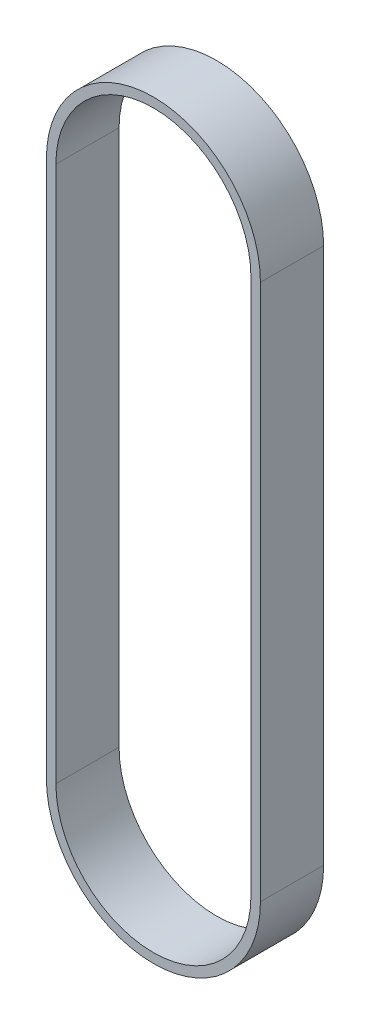
ISO-10303-21;
HEADER;
FILE_DESCRIPTION(('STEP AP214'),'2;1');
FILE_NAME('part.step','',(''),(''),'','','');
FILE_SCHEMA(('AUTOMOTIVE_DESIGN { 1 0 10303 214 1 1 1 1 }'));
ENDSEC;
DATA;
#1=APPLICATION_CONTEXT('core data for automotive mechanical design processes');
#2=APPLICATION_PROTOCOL_DEFINITION('international standard','automotive_design',2000,#1);
#3=PRODUCT_CONTEXT('',#1,'mechanical');
#4=PRODUCT('Part','Part','',(#3));
#5=PRODUCT_RELATED_PRODUCT_CATEGORY('part','',(#4));
#6=PRODUCT_DEFINITION_FORMATION('','',#4);
#7=PRODUCT_DEFINITION_CONTEXT('part definition',#1,'design');
#8=PRODUCT_DEFINITION('design','',#6,#7);
#9=PRODUCT_DEFINITION_SHAPE('','',#8);
#10=(LENGTH_UNIT() NAMED_UNIT(*) SI_UNIT(.MILLI.,.METRE.));
#11=(NAMED_UNIT(*) PLANE_ANGLE_UNIT() SI_UNIT($,.RADIAN.));
#12=(NAMED_UNIT(*) SI_UNIT($,.STERADIAN.) SOLID_ANGLE_UNIT());
#13=UNCERTAINTY_MEASURE_WITH_UNIT(LENGTH_MEASURE(1.E-05),#10,'distance_accuracy_value','');
#14=(GEOMETRIC_REPRESENTATION_CONTEXT(3) GLOBAL_UNCERTAINTY_ASSIGNED_CONTEXT((#13)) GLOBAL_UNIT_ASSIGNED_CONTEXT((#10,
#11,#12)) REPRESENTATION_CONTEXT('',''));
#15=CARTESIAN_POINT('',(0.,0.,0.));
#16=DIRECTION('',(0.,0.,1.));
#17=DIRECTION('',(1.,0.,0.));
#18=AXIS2_PLACEMENT_3D('',#15,#16,#17);
#19=CARTESIAN_POINT('',(2.77555756156289E-13,1.40512601554121E-13,5.));
#20=DIRECTION('',(0.,0.,-1.));
#21=DIRECTION('',(-1.,0.,0.));
#22=AXIS2_PLACEMENT_3D('',#19,#20,#21);
#23=PLANE('',#22);
#24=CARTESIAN_POINT('',(2.77555756156289E-13,1.40512601554121E-13,5.));
#25=DIRECTION('',(0.,0.,-1.));
#26=DIRECTION('',(-1.,0.,0.));
#27=AXIS2_PLACEMENT_3D('',#24,#25,#26);
#28=CIRCLE('',#27,16.935);
#29=CARTESIAN_POINT('',(16.9350000000003,0.,5.));
#30=VERTEX_POINT('',#29);
#31=CARTESIAN_POINT('',(-16.9349999999997,3.88578058618805E-13,5.));
#32=VERTEX_POINT('',#31);
#33=EDGE_CURVE('E164',#30,#32,#28,.F.);
#34=ORIENTED_EDGE('',*,*,#33,.T.);
#35=DIRECTION('',(0.,-1.,0.));
#36=VECTOR('',#35,1.);
#37=CARTESIAN_POINT('',(-16.9349999999997,3.78577960107466E-13,5.));
#38=LINE('',#37,#36);
#39=CARTESIAN_POINT('',(-16.9350000000009,-84.8999999999999,5.));
#40=VERTEX_POINT('',#39);
#41=EDGE_CURVE('E167',#32,#40,#38,.T.);
#42=ORIENTED_EDGE('',*,*,#41,.T.);
#43=CARTESIAN_POINT('',(-9.15933995315754E-13,-84.9000000000001,5.));
#44=DIRECTION('',(0.,0.,-1.));
#45=DIRECTION('',(-1.,0.,0.));
#46=AXIS2_PLACEMENT_3D('',#43,#44,#45);
#47=CIRCLE('',#46,16.935);
#48=CARTESIAN_POINT('',(16.9349999999991,-84.9000000000003,5.));
#49=VERTEX_POINT('',#48);
#50=EDGE_CURVE('E170',#40,#49,#47,.F.);
#51=ORIENTED_EDGE('',*,*,#50,.T.);
#52=DIRECTION('',(0.,1.,0.));
#53=VECTOR('',#52,1.);
#54=CARTESIAN_POINT('',(16.9350000000003,0.,5.));
#55=LINE('',#54,#53);
#56=EDGE_CURVE('E172',#49,#30,#55,.T.);
#57=ORIENTED_EDGE('',*,*,#56,.T.);
#58=EDGE_LOOP('',(#34,#42,#51,#57));
#59=FACE_BOUND('',#58,.T.);
#60=CARTESIAN_POINT('',(2.77555756156289E-13,1.40512601554121E-13,5.));
#61=DIRECTION('',(0.,0.,1.));
#62=DIRECTION('',(-1.,0.,0.));
#63=AXIS2_PLACEMENT_3D('',#60,#61,#62);
#64=CIRCLE('',#63,15.435);
#65=CARTESIAN_POINT('',(15.4350000000003,0.,5.));
#66=VERTEX_POINT('',#65);
#67=CARTESIAN_POINT('',(-15.4349999999997,3.57491568738702E-13,5.));
#68=VERTEX_POINT('',#67);
#69=EDGE_CURVE('E128',#66,#68,#64,.T.);
#70=ORIENTED_EDGE('',*,*,#69,.F.);
#71=DIRECTION('',(0.,1.,0.));
#72=VECTOR('',#71,1.);
#73=CARTESIAN_POINT('',(15.4350000000003,0.,5.));
#74=LINE('',#73,#72);
#75=CARTESIAN_POINT('',(15.4349999999991,-84.9000000000003,5.));
#76=VERTEX_POINT('',#75);
#77=EDGE_CURVE('E150',#76,#66,#74,.T.);
#78=ORIENTED_EDGE('',*,*,#77,.F.);
#79=CARTESIAN_POINT('',(-9.15933995315754E-13,-84.9000000000001,5.));
#80=DIRECTION('',(0.,0.,1.));
#81=DIRECTION('',(-1.,0.,0.));
#82=AXIS2_PLACEMENT_3D('',#79,#80,#81);
#83=CIRCLE('',#82,15.435);
#84=CARTESIAN_POINT('',(-15.4350000000009,-84.8999999999999,5.));
#85=VERTEX_POINT('',#84);
#86=EDGE_CURVE('E148',#85,#76,#83,.T.);
#87=ORIENTED_EDGE('',*,*,#86,.F.);
#88=DIRECTION('',(0.,-1.,0.));
#89=VECTOR('',#88,1.);
#90=CARTESIAN_POINT('',(-15.4350000000009,-84.8999999999999,5.));
#91=LINE('',#90,#89);
#92=EDGE_CURVE('E136',#68,#85,#91,.T.);
#93=ORIENTED_EDGE('',*,*,#92,.F.);
#94=EDGE_LOOP('',(#70,#78,#87,#93));
#95=FACE_BOUND('',#94,.T.);
#96=ADVANCED_FACE('F63',(#59,#95),#23,.F.);
#97=CARTESIAN_POINT('',(2.77555756156289E-13,1.40512601554121E-13,-5.));
#98=DIRECTION('',(0.,0.,-1.));
#99=DIRECTION('',(-1.,0.,0.));
#100=AXIS2_PLACEMENT_3D('',#97,#98,#99);
#101=PLANE('',#100);
#102=CARTESIAN_POINT('',(2.77555756156289E-13,1.40512601554121E-13,-5.));
#103=DIRECTION('',(0.,0.,-1.));
#104=DIRECTION('',(-1.,0.,0.));
#105=AXIS2_PLACEMENT_3D('',#102,#103,#104);
#106=CIRCLE('',#105,16.935);
#107=CARTESIAN_POINT('',(16.9350000000003,0.,-5.));
#108=VERTEX_POINT('',#107);
#109=CARTESIAN_POINT('',(-16.9349999999997,3.88578058618805E-13,-5.));
#110=VERTEX_POINT('',#109);
#111=EDGE_CURVE('E144',#108,#110,#106,.F.);
#112=ORIENTED_EDGE('',*,*,#111,.F.);
#113=DIRECTION('',(0.,1.,0.));
#114=VECTOR('',#113,1.);
#115=CARTESIAN_POINT('',(16.9350000000003,0.,-5.));
#116=LINE('',#115,#114);
#117=CARTESIAN_POINT('',(16.9349999999991,-84.9000000000003,-5.));
#118=VERTEX_POINT('',#117);
#119=EDGE_CURVE('E168',#118,#108,#116,.T.);
#120=ORIENTED_EDGE('',*,*,#119,.F.);
#121=CARTESIAN_POINT('',(-9.15933995315754E-13,-84.9000000000001,-5.));
#122=DIRECTION('',(0.,0.,-1.));
#123=DIRECTION('',(-1.,0.,0.));
#124=AXIS2_PLACEMENT_3D('',#121,#122,#123);
#125=CIRCLE('',#124,16.935);
#126=CARTESIAN_POINT('',(-16.9350000000009,-84.8999999999999,-5.));
#127=VERTEX_POINT('',#126);
#128=EDGE_CURVE('E179',#127,#118,#125,.F.);
#129=ORIENTED_EDGE('',*,*,#128,.F.);
#130=DIRECTION('',(0.,-1.,0.));
#131=VECTOR('',#130,1.);
#132=CARTESIAN_POINT('',(-16.9349999999997,3.78577960107466E-13,-5.));
#133=LINE('',#132,#131);
#134=EDGE_CURVE('E177',#110,#127,#133,.T.);
#135=ORIENTED_EDGE('',*,*,#134,.F.);
#136=EDGE_LOOP('',(#112,#120,#129,#135));
#137=FACE_BOUND('',#136,.T.);
#138=DIRECTION('',(0.,1.,0.));
#139=VECTOR('',#138,1.);
#140=CARTESIAN_POINT('',(15.4350000000003,0.,-5.));
#141=LINE('',#140,#139);
#142=CARTESIAN_POINT('',(15.4349999999991,-84.9000000000003,-5.));
#143=VERTEX_POINT('',#142);
#144=CARTESIAN_POINT('',(15.4350000000003,0.,-5.));
#145=VERTEX_POINT('',#144);
#146=EDGE_CURVE('E137',#143,#145,#141,.T.);
#147=ORIENTED_EDGE('',*,*,#146,.T.);
#148=CARTESIAN_POINT('',(2.77555756156289E-13,1.40512601554121E-13,-5.));
#149=DIRECTION('',(0.,0.,1.));
#150=DIRECTION('',(-1.,0.,0.));
#151=AXIS2_PLACEMENT_3D('',#148,#149,#150);
#152=CIRCLE('',#151,15.435);
#153=CARTESIAN_POINT('',(-15.4349999999997,3.57491568738702E-13,-5.));
#154=VERTEX_POINT('',#153);
#155=EDGE_CURVE('E86',#145,#154,#152,.T.);
#156=ORIENTED_EDGE('',*,*,#155,.T.);
#157=DIRECTION('',(0.,-1.,0.));
#158=VECTOR('',#157,1.);
#159=CARTESIAN_POINT('',(-15.4350000000009,-84.8999999999999,-5.));
#160=LINE('',#159,#158);
#161=CARTESIAN_POINT('',(-15.4350000000009,-84.8999999999999,-5.));
#162=VERTEX_POINT('',#161);
#163=EDGE_CURVE('E143',#154,#162,#160,.T.);
#164=ORIENTED_EDGE('',*,*,#163,.T.);
#165=CARTESIAN_POINT('',(-9.15933995315754E-13,-84.9000000000001,-5.));
#166=DIRECTION('',(0.,0.,1.));
#167=DIRECTION('',(-1.,0.,0.));
#168=AXIS2_PLACEMENT_3D('',#165,#166,#167);
#169=CIRCLE('',#168,15.435);
#170=EDGE_CURVE('E156',#162,#143,#169,.T.);
#171=ORIENTED_EDGE('',*,*,#170,.T.);
#172=EDGE_LOOP('',(#147,#156,#164,#171));
#173=FACE_BOUND('',#172,.T.);
#174=ADVANCED_FACE('F197',(#137,#173),#101,.T.);
#175=CARTESIAN_POINT('',(2.77555756156289E-13,1.40512601554121E-13,5.));
#176=DIRECTION('',(0.,0.,-1.));
#177=DIRECTION('',(-1.,0.,0.));
#178=AXIS2_PLACEMENT_3D('',#175,#176,#177);
#179=CYLINDRICAL_SURFACE('',#178,16.935);
#180=ORIENTED_EDGE('',*,*,#111,.T.);
#181=DIRECTION('',(0.,0.,-1.));
#182=VECTOR('',#181,1.);
#183=CARTESIAN_POINT('',(-16.9349999999997,3.88578058618805E-13,5.));
#184=LINE('',#183,#182);
#185=EDGE_CURVE('E12',#32,#110,#184,.T.);
#186=ORIENTED_EDGE('',*,*,#185,.F.);
#187=ORIENTED_EDGE('',*,*,#33,.F.);
#188=DIRECTION('',(0.,0.,-1.));
#189=VECTOR('',#188,1.);
#190=CARTESIAN_POINT('',(16.9350000000003,0.,5.));
#191=LINE('',#190,#189);
#192=EDGE_CURVE('E174',#30,#108,#191,.T.);
#193=ORIENTED_EDGE('',*,*,#192,.T.);
#194=EDGE_LOOP('',(#180,#186,#187,#193));
#195=FACE_BOUND('',#194,.T.);
#196=ADVANCED_FACE('F65',(#195),#179,.T.);
#197=CARTESIAN_POINT('',(-16.9349999999997,3.78577960107466E-13,5.));
#198=DIRECTION('',(1.,0.,0.));
#199=DIRECTION('',(0.,1.,0.));
#200=AXIS2_PLACEMENT_3D('',#197,#198,#199);
#201=PLANE('',#200);
#202=ORIENTED_EDGE('',*,*,#134,.T.);
#203=DIRECTION('',(0.,0.,-1.));
#204=VECTOR('',#203,1.);
#205=CARTESIAN_POINT('',(-16.9350000000009,-84.8999999999999,5.));
#206=LINE('',#205,#204);
#207=EDGE_CURVE('E71',#40,#127,#206,.T.);
#208=ORIENTED_EDGE('',*,*,#207,.F.);
#209=ORIENTED_EDGE('',*,*,#41,.F.);
#210=ORIENTED_EDGE('',*,*,#185,.T.);
#211=EDGE_LOOP('',(#202,#208,#209,#210));
#212=FACE_BOUND('',#211,.T.);
#213=ADVANCED_FACE('F207',(#212),#201,.F.);
#214=CARTESIAN_POINT('',(-9.15933995315754E-13,-84.9000000000001,5.));
#215=DIRECTION('',(0.,0.,-1.));
#216=DIRECTION('',(-1.,0.,0.));
#217=AXIS2_PLACEMENT_3D('',#214,#215,#216);
#218=CYLINDRICAL_SURFACE('',#217,16.935);
#219=ORIENTED_EDGE('',*,*,#128,.T.);
#220=DIRECTION('',(0.,0.,-1.));
#221=VECTOR('',#220,1.);
#222=CARTESIAN_POINT('',(16.9349999999991,-84.9000000000003,5.));
#223=LINE('',#222,#221);
#224=EDGE_CURVE('E184',#49,#118,#223,.T.);
#225=ORIENTED_EDGE('',*,*,#224,.F.);
#226=ORIENTED_EDGE('',*,*,#50,.F.);
#227=ORIENTED_EDGE('',*,*,#207,.T.);
#228=EDGE_LOOP('',(#219,#225,#226,#227));
#229=FACE_BOUND('',#228,.T.);
#230=ADVANCED_FACE('F191',(#229),#218,.T.);
#231=CARTESIAN_POINT('',(16.9350000000003,0.,5.));
#232=DIRECTION('',(-1.,0.,0.));
#233=DIRECTION('',(0.,-1.,0.));
#234=AXIS2_PLACEMENT_3D('',#231,#232,#233);
#235=PLANE('',#234);
#236=ORIENTED_EDGE('',*,*,#119,.T.);
#237=ORIENTED_EDGE('',*,*,#192,.F.);
#238=ORIENTED_EDGE('',*,*,#56,.F.);
#239=ORIENTED_EDGE('',*,*,#224,.T.);
#240=EDGE_LOOP('',(#236,#237,#238,#239));
#241=FACE_BOUND('',#240,.T.);
#242=ADVANCED_FACE('F201',(#241),#235,.F.);
#243=CARTESIAN_POINT('',(2.77555756156289E-13,1.40512601554121E-13,5.));
#244=DIRECTION('',(0.,0.,-1.));
#245=DIRECTION('',(-1.,0.,0.));
#246=AXIS2_PLACEMENT_3D('',#243,#244,#245);
#247=CYLINDRICAL_SURFACE('',#246,15.435);
#248=ORIENTED_EDGE('',*,*,#155,.F.);
#249=DIRECTION('',(0.,0.,-1.));
#250=VECTOR('',#249,1.);
#251=CARTESIAN_POINT('',(15.4350000000003,0.,5.));
#252=LINE('',#251,#250);
#253=EDGE_CURVE('E132',#66,#145,#252,.T.);
#254=ORIENTED_EDGE('',*,*,#253,.F.);
#255=ORIENTED_EDGE('',*,*,#69,.T.);
#256=DIRECTION('',(0.,0.,-1.));
#257=VECTOR('',#256,1.);
#258=CARTESIAN_POINT('',(-15.4349999999997,3.57491568738702E-13,5.));
#259=LINE('',#258,#257);
#260=EDGE_CURVE('E131',#68,#154,#259,.T.);
#261=ORIENTED_EDGE('',*,*,#260,.T.);
#262=EDGE_LOOP('',(#248,#254,#255,#261));
#263=FACE_BOUND('',#262,.T.);
#264=ADVANCED_FACE('F130',(#263),#247,.F.);
#265=CARTESIAN_POINT('',(-15.4350000000009,-84.8999999999999,5.));
#266=DIRECTION('',(1.,0.,0.));
#267=DIRECTION('',(0.,1.,0.));
#268=AXIS2_PLACEMENT_3D('',#265,#266,#267);
#269=PLANE('',#268);
#270=ORIENTED_EDGE('',*,*,#163,.F.);
#271=ORIENTED_EDGE('',*,*,#260,.F.);
#272=ORIENTED_EDGE('',*,*,#92,.T.);
#273=DIRECTION('',(0.,0.,-1.));
#274=VECTOR('',#273,1.);
#275=CARTESIAN_POINT('',(-15.4350000000009,-84.8999999999999,5.));
#276=LINE('',#275,#274);
#277=EDGE_CURVE('E145',#85,#162,#276,.T.);
#278=ORIENTED_EDGE('',*,*,#277,.T.);
#279=EDGE_LOOP('',(#270,#271,#272,#278));
#280=FACE_BOUND('',#279,.T.);
#281=ADVANCED_FACE('F140',(#280),#269,.T.);
#282=CARTESIAN_POINT('',(-9.15933995315754E-13,-84.9000000000001,5.));
#283=DIRECTION('',(0.,0.,-1.));
#284=DIRECTION('',(-1.,0.,0.));
#285=AXIS2_PLACEMENT_3D('',#282,#283,#284);
#286=CYLINDRICAL_SURFACE('',#285,15.435);
#287=ORIENTED_EDGE('',*,*,#170,.F.);
#288=ORIENTED_EDGE('',*,*,#277,.F.);
#289=ORIENTED_EDGE('',*,*,#86,.T.);
#290=DIRECTION('',(0.,0.,-1.));
#291=VECTOR('',#290,1.);
#292=CARTESIAN_POINT('',(15.4349999999991,-84.9000000000003,5.));
#293=LINE('',#292,#291);
#294=EDGE_CURVE('E78',#76,#143,#293,.T.);
#295=ORIENTED_EDGE('',*,*,#294,.T.);
#296=EDGE_LOOP('',(#287,#288,#289,#295));
#297=FACE_BOUND('',#296,.T.);
#298=ADVANCED_FACE('F230',(#297),#286,.F.);
#299=CARTESIAN_POINT('',(15.4350000000003,0.,5.));
#300=DIRECTION('',(-1.,0.,0.));
#301=DIRECTION('',(0.,-1.,0.));
#302=AXIS2_PLACEMENT_3D('',#299,#300,#301);
#303=PLANE('',#302);
#304=ORIENTED_EDGE('',*,*,#146,.F.);
#305=ORIENTED_EDGE('',*,*,#294,.F.);
#306=ORIENTED_EDGE('',*,*,#77,.T.);
#307=ORIENTED_EDGE('',*,*,#253,.T.);
#308=EDGE_LOOP('',(#304,#305,#306,#307));
#309=FACE_BOUND('',#308,.T.);
#310=ADVANCED_FACE('F234',(#309),#303,.T.);
#311=CLOSED_SHELL('',(#96,#174,#196,#213,#230,#242,#264,#281,#298,#310));
#312=MANIFOLD_SOLID_BREP('B2',#311);
#313=ADVANCED_BREP_SHAPE_REPRESENTATION('',(#18,#312),#14);
#314=SHAPE_DEFINITION_REPRESENTATION(#9,#313);
ENDSEC;
END-ISO-10303-21;
